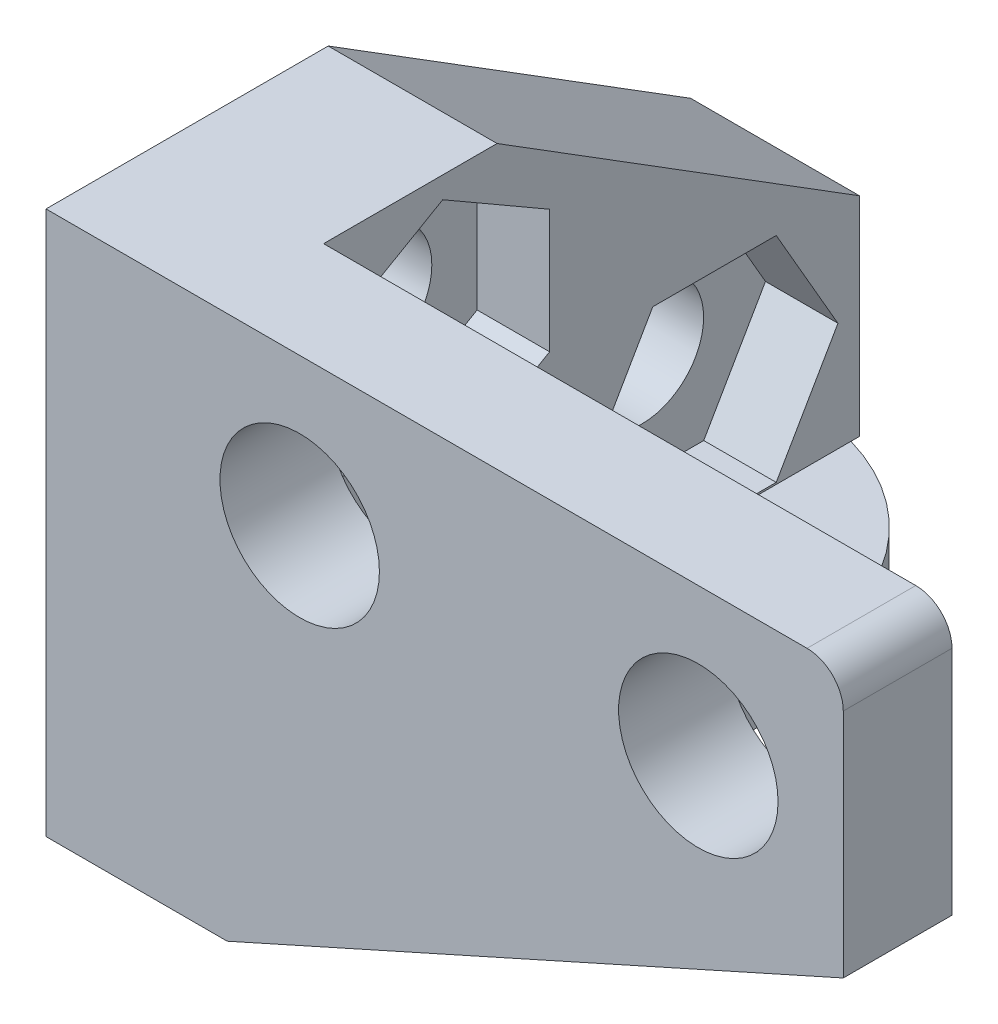
ISO-10303-21;
HEADER;
FILE_DESCRIPTION(('STEP AP214'),'2;1');
FILE_NAME('part.step','',(''),(''),'','','');
FILE_SCHEMA(('AUTOMOTIVE_DESIGN { 1 0 10303 214 1 1 1 1 }'));
ENDSEC;
DATA;
#1=APPLICATION_CONTEXT('core data for automotive mechanical design processes');
#2=APPLICATION_PROTOCOL_DEFINITION('international standard','automotive_design',2000,#1);
#3=PRODUCT_CONTEXT('',#1,'mechanical');
#4=PRODUCT('Part','Part','',(#3));
#5=PRODUCT_RELATED_PRODUCT_CATEGORY('part','',(#4));
#6=PRODUCT_DEFINITION_FORMATION('','',#4);
#7=PRODUCT_DEFINITION_CONTEXT('part definition',#1,'design');
#8=PRODUCT_DEFINITION('design','',#6,#7);
#9=PRODUCT_DEFINITION_SHAPE('','',#8);
#10=(LENGTH_UNIT() NAMED_UNIT(*) SI_UNIT(.MILLI.,.METRE.));
#11=(NAMED_UNIT(*) PLANE_ANGLE_UNIT() SI_UNIT($,.RADIAN.));
#12=(NAMED_UNIT(*) SI_UNIT($,.STERADIAN.) SOLID_ANGLE_UNIT());
#13=UNCERTAINTY_MEASURE_WITH_UNIT(LENGTH_MEASURE(1.E-05),#10,'distance_accuracy_value','');
#14=(GEOMETRIC_REPRESENTATION_CONTEXT(3) GLOBAL_UNCERTAINTY_ASSIGNED_CONTEXT((#13)) GLOBAL_UNIT_ASSIGNED_CONTEXT((#10,
#11,#12)) REPRESENTATION_CONTEXT('',''));
#15=CARTESIAN_POINT('',(0.,0.,0.));
#16=DIRECTION('',(0.,0.,1.));
#17=DIRECTION('',(1.,0.,0.));
#18=AXIS2_PLACEMENT_3D('',#15,#16,#17);
#19=CARTESIAN_POINT('',(1.99999999999999,4.00000000000002,-8.7866151357743));
#20=DIRECTION('',(-1.,0.,0.));
#21=DIRECTION('',(0.,-1.,0.));
#22=AXIS2_PLACEMENT_3D('',#19,#20,#21);
#23=CYLINDRICAL_SURFACE('',#22,1.7);
#24=CARTESIAN_POINT('',(-20.,4.00000000000001,-8.7866151357743));
#25=DIRECTION('',(-1.,0.,0.));
#26=DIRECTION('',(0.,-1.,0.));
#27=AXIS2_PLACEMENT_3D('',#24,#25,#26);
#28=CIRCLE('',#27,1.7);
#29=CARTESIAN_POINT('',(-20.,2.30000000000001,-8.7866151357743));
#30=VERTEX_POINT('',#29);
#31=EDGE_CURVE('E348',#30,#30,#28,.T.);
#32=ORIENTED_EDGE('',*,*,#31,.T.);
#33=EDGE_LOOP('',(#32));
#34=FACE_BOUND('',#33,.T.);
#35=CARTESIAN_POINT('',(-17.34,4.00000000000001,-8.7866151357743));
#36=DIRECTION('',(1.,0.,0.));
#37=DIRECTION('',(0.,0.,-1.));
#38=AXIS2_PLACEMENT_3D('',#35,#36,#37);
#39=CIRCLE('',#38,1.7);
#40=CARTESIAN_POINT('',(-17.34,4.00000000000001,-10.4866151357743));
#41=VERTEX_POINT('',#40);
#42=EDGE_CURVE('E45',#41,#41,#39,.F.);
#43=ORIENTED_EDGE('',*,*,#42,.F.);
#44=EDGE_LOOP('',(#43));
#45=FACE_BOUND('',#44,.T.);
#46=ADVANCED_FACE('F41',(#34,#45),#23,.F.);
#47=CARTESIAN_POINT('',(1.99999999999999,9.00000000000002,-1.2866151357743));
#48=DIRECTION('',(-1.,0.,0.));
#49=DIRECTION('',(0.,-1.,0.));
#50=AXIS2_PLACEMENT_3D('',#47,#48,#49);
#51=CYLINDRICAL_SURFACE('',#50,1.7);
#52=CARTESIAN_POINT('',(-20.,9.00000000000001,-1.2866151357743));
#53=DIRECTION('',(-1.,0.,0.));
#54=DIRECTION('',(0.,-1.,0.));
#55=AXIS2_PLACEMENT_3D('',#52,#53,#54);
#56=CIRCLE('',#55,1.7);
#57=CARTESIAN_POINT('',(-20.,7.30000000000001,-1.2866151357743));
#58=VERTEX_POINT('',#57);
#59=EDGE_CURVE('E345',#58,#58,#56,.T.);
#60=ORIENTED_EDGE('',*,*,#59,.T.);
#61=EDGE_LOOP('',(#60));
#62=FACE_BOUND('',#61,.T.);
#63=CARTESIAN_POINT('',(-17.34,9.00000000000001,-1.2866151357743));
#64=DIRECTION('',(1.,0.,0.));
#65=DIRECTION('',(0.,0.,-1.));
#66=AXIS2_PLACEMENT_3D('',#63,#64,#65);
#67=CIRCLE('',#66,1.7);
#68=CARTESIAN_POINT('',(-17.34,9.00000000000001,-2.9866151357743));
#69=VERTEX_POINT('',#68);
#70=EDGE_CURVE('E304',#69,#69,#67,.F.);
#71=ORIENTED_EDGE('',*,*,#70,.F.);
#72=EDGE_LOOP('',(#71));
#73=FACE_BOUND('',#72,.T.);
#74=ADVANCED_FACE('F503',(#62,#73),#51,.F.);
#75=CARTESIAN_POINT('',(0.,0.,2.));
#76=DIRECTION('',(0.,0.,-1.));
#77=DIRECTION('',(-1.,0.,0.));
#78=AXIS2_PLACEMENT_3D('',#75,#76,#77);
#79=PLANE('',#78);
#80=CARTESIAN_POINT('',(-2.00000000000001,8.93226907062247,2.));
#81=DIRECTION('',(0.,0.,-1.));
#82=DIRECTION('',(-1.,0.,0.));
#83=AXIS2_PLACEMENT_3D('',#80,#81,#82);
#84=CIRCLE('',#83,2.2);
#85=CARTESIAN_POINT('',(-4.20000000000001,8.93226907062247,2.));
#86=VERTEX_POINT('',#85);
#87=EDGE_CURVE('E336',#86,#86,#84,.T.);
#88=ORIENTED_EDGE('',*,*,#87,.F.);
#89=EDGE_LOOP('',(#88));
#90=FACE_BOUND('',#89,.T.);
#91=CARTESIAN_POINT('',(-13.,8.93226907062247,2.));
#92=DIRECTION('',(0.,0.,-1.));
#93=DIRECTION('',(-1.,0.,0.));
#94=AXIS2_PLACEMENT_3D('',#91,#92,#93);
#95=CIRCLE('',#94,2.2);
#96=CARTESIAN_POINT('',(-15.2,8.93226907062247,2.));
#97=VERTEX_POINT('',#96);
#98=EDGE_CURVE('E342',#97,#97,#95,.T.);
#99=ORIENTED_EDGE('',*,*,#98,.F.);
#100=EDGE_LOOP('',(#99));
#101=FACE_BOUND('',#100,.T.);
#102=DIRECTION('',(-1.,0.,0.));
#103=VECTOR('',#102,1.);
#104=CARTESIAN_POINT('',(0.,1.00000000000001,2.));
#105=LINE('',#104,#103);
#106=CARTESIAN_POINT('',(-9.,1.00000000000001,2.));
#107=VERTEX_POINT('',#106);
#108=CARTESIAN_POINT('',(-15.34,1.00000000000001,2.));
#109=VERTEX_POINT('',#108);
#110=EDGE_CURVE('E384',#107,#109,#105,.T.);
#111=ORIENTED_EDGE('',*,*,#110,.T.);
#112=DIRECTION('',(0.,-1.,0.));
#113=VECTOR('',#112,1.);
#114=CARTESIAN_POINT('',(-15.34,1.00000000000001,2.));
#115=LINE('',#114,#113);
#116=CARTESIAN_POINT('',(-15.34,13.,2.));
#117=VERTEX_POINT('',#116);
#118=EDGE_CURVE('E327',#117,#109,#115,.T.);
#119=ORIENTED_EDGE('',*,*,#118,.F.);
#120=DIRECTION('',(1.,0.,0.));
#121=VECTOR('',#120,1.);
#122=CARTESIAN_POINT('',(2.97851411655218,13.,2.));
#123=LINE('',#122,#121);
#124=CARTESIAN_POINT('',(0.999999999999988,13.,2.));
#125=VERTEX_POINT('',#124);
#126=EDGE_CURVE('E407',#117,#125,#123,.T.);
#127=ORIENTED_EDGE('',*,*,#126,.T.);
#128=CARTESIAN_POINT('',(0.999999999999988,12.,2.));
#129=DIRECTION('',(0.,0.,-1.));
#130=DIRECTION('',(-1.,0.,0.));
#131=AXIS2_PLACEMENT_3D('',#128,#129,#130);
#132=CIRCLE('',#131,1.);
#133=CARTESIAN_POINT('',(1.99999999999999,12.,2.));
#134=VERTEX_POINT('',#133);
#135=EDGE_CURVE('E398',#134,#125,#132,.F.);
#136=ORIENTED_EDGE('',*,*,#135,.F.);
#137=DIRECTION('',(0.,1.,0.));
#138=VECTOR('',#137,1.);
#139=CARTESIAN_POINT('',(1.99999999999999,0.,2.));
#140=LINE('',#139,#138);
#141=CARTESIAN_POINT('',(1.99999999999999,5.62068965517242,2.));
#142=VERTEX_POINT('',#141);
#143=EDGE_CURVE('E404',#142,#134,#140,.T.);
#144=ORIENTED_EDGE('',*,*,#143,.F.);
#145=DIRECTION('',(-0.912509324514951,-0.409055904092909,0.));
#146=VECTOR('',#145,1.);
#147=CARTESIAN_POINT('',(-1.76336633663367,3.93366336633664,2.));
#148=LINE('',#147,#146);
#149=CARTESIAN_POINT('',(-8.99999999999998,0.689655172413814,2.));
#150=VERTEX_POINT('',#149);
#151=EDGE_CURVE('E410',#142,#150,#148,.T.);
#152=ORIENTED_EDGE('',*,*,#151,.T.);
#153=DIRECTION('',(0.,-1.,0.));
#154=VECTOR('',#153,1.);
#155=CARTESIAN_POINT('',(-8.99999999999998,1.00000000000001,2.));
#156=LINE('',#155,#154);
#157=EDGE_CURVE('E381',#107,#150,#156,.T.);
#158=ORIENTED_EDGE('',*,*,#157,.F.);
#159=EDGE_LOOP('',(#111,#119,#127,#136,#144,#152,#158));
#160=FACE_BOUND('',#159,.T.);
#161=ADVANCED_FACE('F465',(#90,#101,#160),#79,.T.);
#162=CARTESIAN_POINT('',(0.,1.00000000000001,0.));
#163=DIRECTION('',(0.,-1.,0.));
#164=DIRECTION('',(1.,0.,0.));
#165=AXIS2_PLACEMENT_3D('',#162,#163,#164);
#166=PLANE('',#165);
#167=DIRECTION('',(0.,0.,-1.));
#168=VECTOR('',#167,1.);
#169=CARTESIAN_POINT('',(-15.34,1.00000000000001,-12.7866151357743));
#170=LINE('',#169,#168);
#171=CARTESIAN_POINT('',(-15.34,1.00000000000001,-12.5524108310795));
#172=VERTEX_POINT('',#171);
#173=EDGE_CURVE('E314',#109,#172,#170,.T.);
#174=ORIENTED_EDGE('',*,*,#173,.F.);
#175=ORIENTED_EDGE('',*,*,#110,.F.);
#176=CARTESIAN_POINT('',(-9.,1.00000000000001,0.));
#177=DIRECTION('',(0.,-1.,0.));
#178=DIRECTION('',(1.,0.,0.));
#179=AXIS2_PLACEMENT_3D('',#176,#177,#178);
#180=CIRCLE('',#179,2.);
#181=CARTESIAN_POINT('',(-11.,1.00000000000001,0.));
#182=VERTEX_POINT('',#181);
#183=EDGE_CURVE('E375',#182,#107,#180,.F.);
#184=ORIENTED_EDGE('',*,*,#183,.F.);
#185=DIRECTION('',(0.,0.,1.));
#186=VECTOR('',#185,1.);
#187=CARTESIAN_POINT('',(-11.,1.00000000000001,0.));
#188=LINE('',#187,#186);
#189=CARTESIAN_POINT('',(-11.,1.00000000000001,-6.78661513577429));
#190=VERTEX_POINT('',#189);
#191=EDGE_CURVE('E371',#190,#182,#188,.T.);
#192=ORIENTED_EDGE('',*,*,#191,.F.);
#193=CARTESIAN_POINT('',(-17.,1.00000000000001,-6.78661513577426));
#194=DIRECTION('',(0.,-1.,0.));
#195=DIRECTION('',(1.,0.,0.));
#196=AXIS2_PLACEMENT_3D('',#193,#194,#195);
#197=CIRCLE('',#196,6.00000000000003);
#198=EDGE_CURVE('E372',#172,#190,#197,.T.);
#199=ORIENTED_EDGE('',*,*,#198,.F.);
#200=EDGE_LOOP('',(#174,#175,#184,#192,#199));
#201=FACE_BOUND('',#200,.T.);
#202=ADVANCED_FACE('F439',(#201),#166,.F.);
#203=CARTESIAN_POINT('',(-1.76336633663367,3.93366336633664,0.));
#204=DIRECTION('',(-0.409055904092909,0.912509324514951,0.));
#205=DIRECTION('',(-0.912509324514951,-0.409055904092909,0.));
#206=AXIS2_PLACEMENT_3D('',#203,#204,#205);
#207=PLANE('',#206);
#208=DIRECTION('',(-0.912509324514951,-0.409055904092909,0.));
#209=VECTOR('',#208,1.);
#210=CARTESIAN_POINT('',(-1.76336633663367,3.93366336633664,5.));
#211=LINE('',#210,#209);
#212=CARTESIAN_POINT('',(1.99999999999999,5.62068965517242,5.));
#213=VERTEX_POINT('',#212);
#214=CARTESIAN_POINT('',(-15.,-1.99999999999999,5.));
#215=VERTEX_POINT('',#214);
#216=EDGE_CURVE('E477',#213,#215,#211,.T.);
#217=ORIENTED_EDGE('',*,*,#216,.T.);
#218=DIRECTION('',(0.,0.,1.));
#219=VECTOR('',#218,1.);
#220=CARTESIAN_POINT('',(-15.,-1.99999999999999,0.));
#221=LINE('',#220,#219);
#222=CARTESIAN_POINT('',(-15.,-1.99999999999999,-12.4434693852667));
#223=VERTEX_POINT('',#222);
#224=EDGE_CURVE('E450',#223,#215,#221,.T.);
#225=ORIENTED_EDGE('',*,*,#224,.F.);
#226=CARTESIAN_POINT('',(-17.,-2.89655172413793,-6.78661513577426));
#227=DIRECTION('',(-0.409055904092909,0.912509324514951,0.));
#228=DIRECTION('',(-0.912509324514951,-0.409055904092909,0.));
#229=AXIS2_PLACEMENT_3D('',#226,#227,#228);
#230=ELLIPSE('',#229,6.57527527533964,6.00000000000003);
#231=CARTESIAN_POINT('',(-11.,-0.206896551724127,-6.78661513577429));
#232=VERTEX_POINT('',#231);
#233=EDGE_CURVE('E12',#223,#232,#230,.F.);
#234=ORIENTED_EDGE('',*,*,#233,.T.);
#235=DIRECTION('',(0.,0.,1.));
#236=VECTOR('',#235,1.);
#237=CARTESIAN_POINT('',(-11.,-0.206896551724127,0.));
#238=LINE('',#237,#236);
#239=CARTESIAN_POINT('',(-11.,-0.206896551724127,0.));
#240=VERTEX_POINT('',#239);
#241=EDGE_CURVE('E363',#232,#240,#238,.T.);
#242=ORIENTED_EDGE('',*,*,#241,.T.);
#243=CARTESIAN_POINT('',(-9.,0.689655172413805,0.));
#244=DIRECTION('',(-0.409055904092909,0.912509324514951,0.));
#245=DIRECTION('',(-0.912509324514951,-0.409055904092909,0.));
#246=AXIS2_PLACEMENT_3D('',#243,#244,#245);
#247=ELLIPSE('',#246,2.1917584251132,2.);
#248=EDGE_CURVE('E365',#240,#150,#247,.T.);
#249=ORIENTED_EDGE('',*,*,#248,.T.);
#250=ORIENTED_EDGE('',*,*,#151,.F.);
#251=DIRECTION('',(0.,0.,-1.));
#252=VECTOR('',#251,1.);
#253=CARTESIAN_POINT('',(1.99999999999999,5.62068965517242,0.));
#254=LINE('',#253,#252);
#255=EDGE_CURVE('E485',#213,#142,#254,.T.);
#256=ORIENTED_EDGE('',*,*,#255,.F.);
#257=EDGE_LOOP('',(#217,#225,#234,#242,#249,#250,#256));
#258=FACE_BOUND('',#257,.T.);
#259=ADVANCED_FACE('F489',(#258),#207,.F.);
#260=CARTESIAN_POINT('',(2.97851411655218,13.,0.));
#261=DIRECTION('',(0.,-1.,0.));
#262=DIRECTION('',(1.,0.,0.));
#263=AXIS2_PLACEMENT_3D('',#260,#261,#262);
#264=PLANE('',#263);
#265=DIRECTION('',(1.,0.,0.));
#266=VECTOR('',#265,1.);
#267=CARTESIAN_POINT('',(-20.,13.,-2.78661513577426));
#268=LINE('',#267,#266);
#269=CARTESIAN_POINT('',(-20.,13.,-2.78661513577426));
#270=VERTEX_POINT('',#269);
#271=CARTESIAN_POINT('',(-15.34,13.,-2.78661513577426));
#272=VERTEX_POINT('',#271);
#273=EDGE_CURVE('E396',#270,#272,#268,.T.);
#274=ORIENTED_EDGE('',*,*,#273,.F.);
#275=DIRECTION('',(0.,0.,-1.));
#276=VECTOR('',#275,1.);
#277=CARTESIAN_POINT('',(-20.,13.,-2.78661513577426));
#278=LINE('',#277,#276);
#279=CARTESIAN_POINT('',(-20.,13.,5.));
#280=VERTEX_POINT('',#279);
#281=EDGE_CURVE('E353',#280,#270,#278,.T.);
#282=ORIENTED_EDGE('',*,*,#281,.F.);
#283=DIRECTION('',(1.,0.,0.));
#284=VECTOR('',#283,1.);
#285=CARTESIAN_POINT('',(0.,13.,5.));
#286=LINE('',#285,#284);
#287=CARTESIAN_POINT('',(0.999999999999988,13.,5.));
#288=VERTEX_POINT('',#287);
#289=EDGE_CURVE('E482',#280,#288,#286,.T.);
#290=ORIENTED_EDGE('',*,*,#289,.T.);
#291=DIRECTION('',(0.,0.,1.));
#292=VECTOR('',#291,1.);
#293=CARTESIAN_POINT('',(0.999999999999988,13.,0.));
#294=LINE('',#293,#292);
#295=EDGE_CURVE('E50',#288,#125,#294,.F.);
#296=ORIENTED_EDGE('',*,*,#295,.T.);
#297=ORIENTED_EDGE('',*,*,#126,.F.);
#298=DIRECTION('',(0.,0.,1.));
#299=VECTOR('',#298,1.);
#300=CARTESIAN_POINT('',(-15.34,13.,2.));
#301=LINE('',#300,#299);
#302=EDGE_CURVE('E324',#272,#117,#301,.T.);
#303=ORIENTED_EDGE('',*,*,#302,.F.);
#304=EDGE_LOOP('',(#274,#282,#290,#296,#297,#303));
#305=FACE_BOUND('',#304,.T.);
#306=ADVANCED_FACE('F460',(#305),#264,.F.);
#307=CARTESIAN_POINT('',(0.,-1.99999999999999,0.));
#308=DIRECTION('',(0.,1.,0.));
#309=DIRECTION('',(-1.,0.,0.));
#310=AXIS2_PLACEMENT_3D('',#307,#308,#309);
#311=PLANE('',#310);
#312=DIRECTION('',(1.,0.,0.));
#313=VECTOR('',#312,1.);
#314=CARTESIAN_POINT('',(-20.,-1.99999999999999,5.));
#315=LINE('',#314,#313);
#316=CARTESIAN_POINT('',(-20.,-1.99999999999999,5.));
#317=VERTEX_POINT('',#316);
#318=EDGE_CURVE('E361',#317,#215,#315,.T.);
#319=ORIENTED_EDGE('',*,*,#318,.F.);
#320=DIRECTION('',(0.,0.,1.));
#321=VECTOR('',#320,1.);
#322=CARTESIAN_POINT('',(-20.,-1.99999999999999,5.));
#323=LINE('',#322,#321);
#324=CARTESIAN_POINT('',(-20.,-1.99999999999998,-12.7866151357743));
#325=VERTEX_POINT('',#324);
#326=EDGE_CURVE('E359',#325,#317,#323,.T.);
#327=ORIENTED_EDGE('',*,*,#326,.F.);
#328=DIRECTION('',(1.,0.,0.));
#329=VECTOR('',#328,1.);
#330=CARTESIAN_POINT('',(-20.,-1.99999999999998,-12.7866151357743));
#331=LINE('',#330,#329);
#332=CARTESIAN_POINT('',(-17.,-1.99999999999999,-12.7866151357743));
#333=VERTEX_POINT('',#332);
#334=EDGE_CURVE('E395',#325,#333,#331,.T.);
#335=ORIENTED_EDGE('',*,*,#334,.T.);
#336=CARTESIAN_POINT('',(-17.,-1.99999999999999,-6.78661513577426));
#337=DIRECTION('',(0.,-1.,0.));
#338=DIRECTION('',(1.,0.,0.));
#339=AXIS2_PLACEMENT_3D('',#336,#337,#338);
#340=CIRCLE('',#339,6.00000000000003);
#341=EDGE_CURVE('E368',#333,#223,#340,.T.);
#342=ORIENTED_EDGE('',*,*,#341,.T.);
#343=ORIENTED_EDGE('',*,*,#224,.T.);
#344=EDGE_LOOP('',(#319,#327,#335,#342,#343));
#345=FACE_BOUND('',#344,.T.);
#346=ADVANCED_FACE('F449',(#345),#311,.F.);
#347=CARTESIAN_POINT('',(1.99999999999999,0.,10.));
#348=DIRECTION('',(1.,0.,0.));
#349=DIRECTION('',(0.,0.,-1.));
#350=AXIS2_PLACEMENT_3D('',#347,#348,#349);
#351=PLANE('',#350);
#352=ORIENTED_EDGE('',*,*,#255,.T.);
#353=ORIENTED_EDGE('',*,*,#143,.T.);
#354=DIRECTION('',(0.,0.,1.));
#355=VECTOR('',#354,1.);
#356=CARTESIAN_POINT('',(1.99999999999999,12.,5.));
#357=LINE('',#356,#355);
#358=CARTESIAN_POINT('',(1.99999999999999,12.,5.));
#359=VERTEX_POINT('',#358);
#360=EDGE_CURVE('E470',#134,#359,#357,.T.);
#361=ORIENTED_EDGE('',*,*,#360,.T.);
#362=DIRECTION('',(0.,1.,0.));
#363=VECTOR('',#362,1.);
#364=CARTESIAN_POINT('',(1.99999999999999,0.,5.));
#365=LINE('',#364,#363);
#366=EDGE_CURVE('E484',#213,#359,#365,.T.);
#367=ORIENTED_EDGE('',*,*,#366,.F.);
#368=EDGE_LOOP('',(#352,#353,#361,#367));
#369=FACE_BOUND('',#368,.T.);
#370=ADVANCED_FACE('F535',(#369),#351,.T.);
#371=CARTESIAN_POINT('',(0.999999999999988,12.,10.));
#372=DIRECTION('',(0.,0.,-1.));
#373=DIRECTION('',(-1.,0.,0.));
#374=AXIS2_PLACEMENT_3D('',#371,#372,#373);
#375=CYLINDRICAL_SURFACE('',#374,1.);
#376=ORIENTED_EDGE('',*,*,#360,.F.);
#377=ORIENTED_EDGE('',*,*,#135,.T.);
#378=ORIENTED_EDGE('',*,*,#295,.F.);
#379=CARTESIAN_POINT('',(0.999999999999988,12.,5.));
#380=DIRECTION('',(0.,0.,1.));
#381=DIRECTION('',(1.,0.,0.));
#382=AXIS2_PLACEMENT_3D('',#379,#380,#381);
#383=CIRCLE('',#382,1.);
#384=EDGE_CURVE('E472',#359,#288,#383,.T.);
#385=ORIENTED_EDGE('',*,*,#384,.F.);
#386=EDGE_LOOP('',(#376,#377,#378,#385));
#387=FACE_BOUND('',#386,.T.);
#388=ADVANCED_FACE('F43',(#387),#375,.T.);
#389=CARTESIAN_POINT('',(0.,0.,5.));
#390=DIRECTION('',(0.,0.,1.));
#391=DIRECTION('',(1.,0.,0.));
#392=AXIS2_PLACEMENT_3D('',#389,#390,#391);
#393=PLANE('',#392);
#394=CARTESIAN_POINT('',(-2.00000000000001,8.93226907062247,5.));
#395=DIRECTION('',(0.,0.,1.));
#396=DIRECTION('',(1.,0.,0.));
#397=AXIS2_PLACEMENT_3D('',#394,#395,#396);
#398=CIRCLE('',#397,2.2);
#399=CARTESIAN_POINT('',(0.199999999999988,8.93226907062247,5.));
#400=VERTEX_POINT('',#399);
#401=EDGE_CURVE('E333',#400,#400,#398,.T.);
#402=ORIENTED_EDGE('',*,*,#401,.F.);
#403=EDGE_LOOP('',(#402));
#404=FACE_BOUND('',#403,.T.);
#405=CARTESIAN_POINT('',(-13.,8.93226907062247,5.));
#406=DIRECTION('',(0.,0.,1.));
#407=DIRECTION('',(1.,0.,0.));
#408=AXIS2_PLACEMENT_3D('',#405,#406,#407);
#409=CIRCLE('',#408,2.2);
#410=CARTESIAN_POINT('',(-10.8,8.93226907062247,5.));
#411=VERTEX_POINT('',#410);
#412=EDGE_CURVE('E339',#411,#411,#409,.T.);
#413=ORIENTED_EDGE('',*,*,#412,.F.);
#414=EDGE_LOOP('',(#413));
#415=FACE_BOUND('',#414,.T.);
#416=DIRECTION('',(0.,1.,0.));
#417=VECTOR('',#416,1.);
#418=CARTESIAN_POINT('',(-20.,13.,5.));
#419=LINE('',#418,#417);
#420=EDGE_CURVE('E351',#317,#280,#419,.T.);
#421=ORIENTED_EDGE('',*,*,#420,.F.);
#422=ORIENTED_EDGE('',*,*,#318,.T.);
#423=ORIENTED_EDGE('',*,*,#216,.F.);
#424=ORIENTED_EDGE('',*,*,#366,.T.);
#425=ORIENTED_EDGE('',*,*,#384,.T.);
#426=ORIENTED_EDGE('',*,*,#289,.F.);
#427=EDGE_LOOP('',(#421,#422,#423,#424,#425,#426));
#428=FACE_BOUND('',#427,.T.);
#429=ADVANCED_FACE('F541',(#404,#415,#428),#393,.T.);
#430=CARTESIAN_POINT('',(-20.,10.6017090008096,-6.62468303246712));
#431=DIRECTION('',(0.,-0.848048096156427,0.529919264233203));
#432=DIRECTION('',(0.,-0.529919264233203,-0.848048096156427));
#433=AXIS2_PLACEMENT_3D('',#430,#431,#432);
#434=PLANE('',#433);
#435=DIRECTION('',(1.,0.,0.));
#436=VECTOR('',#435,1.);
#437=CARTESIAN_POINT('',(-20.,6.75130648090675,-12.7866151357743));
#438=LINE('',#437,#436);
#439=CARTESIAN_POINT('',(-20.,6.75130648090675,-12.7866151357743));
#440=VERTEX_POINT('',#439);
#441=CARTESIAN_POINT('',(-15.34,6.75130648090675,-12.7866151357743));
#442=VERTEX_POINT('',#441);
#443=EDGE_CURVE('E399',#440,#442,#438,.T.);
#444=ORIENTED_EDGE('',*,*,#443,.F.);
#445=DIRECTION('',(0.,-0.529919264233203,-0.848048096156427));
#446=VECTOR('',#445,1.);
#447=CARTESIAN_POINT('',(-20.,6.75130648090675,-12.7866151357743));
#448=LINE('',#447,#446);
#449=EDGE_CURVE('E355',#270,#440,#448,.T.);
#450=ORIENTED_EDGE('',*,*,#449,.F.);
#451=ORIENTED_EDGE('',*,*,#273,.T.);
#452=DIRECTION('',(0.,0.529919264233203,0.848048096156427));
#453=VECTOR('',#452,1.);
#454=CARTESIAN_POINT('',(-15.34,13.,-2.78661513577426));
#455=LINE('',#454,#453);
#456=EDGE_CURVE('E321',#442,#272,#455,.T.);
#457=ORIENTED_EDGE('',*,*,#456,.F.);
#458=EDGE_LOOP('',(#444,#450,#451,#457));
#459=FACE_BOUND('',#458,.T.);
#460=ADVANCED_FACE('F455',(#459),#434,.F.);
#461=CARTESIAN_POINT('',(-20.,0.,-12.7866151357743));
#462=DIRECTION('',(0.,0.,1.));
#463=DIRECTION('',(1.,0.,0.));
#464=AXIS2_PLACEMENT_3D('',#461,#462,#463);
#465=PLANE('',#464);
#466=ORIENTED_EDGE('',*,*,#334,.F.);
#467=DIRECTION('',(0.,-1.,0.));
#468=VECTOR('',#467,1.);
#469=CARTESIAN_POINT('',(-20.,-1.99999999999998,-12.7866151357743));
#470=LINE('',#469,#468);
#471=EDGE_CURVE('E357',#440,#325,#470,.T.);
#472=ORIENTED_EDGE('',*,*,#471,.F.);
#473=ORIENTED_EDGE('',*,*,#443,.T.);
#474=DIRECTION('',(0.,1.,0.));
#475=VECTOR('',#474,1.);
#476=CARTESIAN_POINT('',(-15.34,6.75130648090675,-12.7866151357743));
#477=LINE('',#476,#475);
#478=CARTESIAN_POINT('',(-15.34,1.00000000000001,-12.7866151357743));
#479=VERTEX_POINT('',#478);
#480=EDGE_CURVE('E317',#479,#442,#477,.T.);
#481=ORIENTED_EDGE('',*,*,#480,.F.);
#482=DIRECTION('',(-1.,0.,0.));
#483=VECTOR('',#482,1.);
#484=CARTESIAN_POINT('',(-15.34,1.00000000000001,-12.7866151357743));
#485=LINE('',#484,#483);
#486=CARTESIAN_POINT('',(-17.,1.00000000000001,-12.7866151357743));
#487=VERTEX_POINT('',#486);
#488=EDGE_CURVE('E330',#479,#487,#485,.T.);
#489=ORIENTED_EDGE('',*,*,#488,.T.);
#490=DIRECTION('',(0.,-1.,0.));
#491=VECTOR('',#490,1.);
#492=CARTESIAN_POINT('',(-17.,1.00000000000001,-12.7866151357743));
#493=LINE('',#492,#491);
#494=EDGE_CURVE('E378',#487,#333,#493,.T.);
#495=ORIENTED_EDGE('',*,*,#494,.T.);
#496=EDGE_LOOP('',(#466,#472,#473,#481,#489,#495));
#497=FACE_BOUND('',#496,.T.);
#498=ADVANCED_FACE('F427',(#497),#465,.F.);
#499=CARTESIAN_POINT('',(-9.,1.00000000000001,0.));
#500=DIRECTION('',(0.,-1.,0.));
#501=DIRECTION('',(1.,0.,0.));
#502=AXIS2_PLACEMENT_3D('',#499,#500,#501);
#503=CYLINDRICAL_SURFACE('',#502,2.);
#504=ORIENTED_EDGE('',*,*,#248,.F.);
#505=DIRECTION('',(0.,-1.,0.));
#506=VECTOR('',#505,1.);
#507=CARTESIAN_POINT('',(-11.,1.00000000000001,0.));
#508=LINE('',#507,#506);
#509=EDGE_CURVE('E385',#182,#240,#508,.T.);
#510=ORIENTED_EDGE('',*,*,#509,.F.);
#511=ORIENTED_EDGE('',*,*,#183,.T.);
#512=ORIENTED_EDGE('',*,*,#157,.T.);
#513=EDGE_LOOP('',(#504,#510,#511,#512));
#514=FACE_BOUND('',#513,.T.);
#515=ADVANCED_FACE('F491',(#514),#503,.F.);
#516=CARTESIAN_POINT('',(-11.,1.00000000000001,0.));
#517=DIRECTION('',(1.,0.,0.));
#518=DIRECTION('',(0.,1.,0.));
#519=AXIS2_PLACEMENT_3D('',#516,#517,#518);
#520=PLANE('',#519);
#521=ORIENTED_EDGE('',*,*,#241,.F.);
#522=DIRECTION('',(0.,-1.,0.));
#523=VECTOR('',#522,1.);
#524=CARTESIAN_POINT('',(-11.,1.00000000000001,-6.78661513577429));
#525=LINE('',#524,#523);
#526=EDGE_CURVE('E388',#190,#232,#525,.T.);
#527=ORIENTED_EDGE('',*,*,#526,.F.);
#528=ORIENTED_EDGE('',*,*,#191,.T.);
#529=ORIENTED_EDGE('',*,*,#509,.T.);
#530=EDGE_LOOP('',(#521,#527,#528,#529));
#531=FACE_BOUND('',#530,.T.);
#532=ADVANCED_FACE('F444',(#531),#520,.T.);
#533=CARTESIAN_POINT('',(-17.,1.00000000000001,-6.78661513577426));
#534=DIRECTION('',(0.,-1.,0.));
#535=DIRECTION('',(1.,0.,0.));
#536=AXIS2_PLACEMENT_3D('',#533,#534,#535);
#537=CYLINDRICAL_SURFACE('',#536,6.00000000000003);
#538=ORIENTED_EDGE('',*,*,#233,.F.);
#539=ORIENTED_EDGE('',*,*,#341,.F.);
#540=ORIENTED_EDGE('',*,*,#494,.F.);
#541=EDGE_CURVE('E369',#487,#172,#197,.T.);
#542=ORIENTED_EDGE('',*,*,#541,.T.);
#543=ORIENTED_EDGE('',*,*,#198,.T.);
#544=ORIENTED_EDGE('',*,*,#526,.T.);
#545=EDGE_LOOP('',(#538,#539,#540,#542,#543,#544));
#546=FACE_BOUND('',#545,.T.);
#547=ADVANCED_FACE('F434',(#546),#537,.T.);
#548=CARTESIAN_POINT('',(-20.,0.,0.));
#549=DIRECTION('',(1.,0.,0.));
#550=DIRECTION('',(0.,1.,0.));
#551=AXIS2_PLACEMENT_3D('',#548,#549,#550);
#552=PLANE('',#551);
#553=ORIENTED_EDGE('',*,*,#59,.F.);
#554=EDGE_LOOP('',(#553));
#555=FACE_BOUND('',#554,.T.);
#556=ORIENTED_EDGE('',*,*,#31,.F.);
#557=EDGE_LOOP('',(#556));
#558=FACE_BOUND('',#557,.T.);
#559=ORIENTED_EDGE('',*,*,#420,.T.);
#560=ORIENTED_EDGE('',*,*,#281,.T.);
#561=ORIENTED_EDGE('',*,*,#449,.T.);
#562=ORIENTED_EDGE('',*,*,#471,.T.);
#563=ORIENTED_EDGE('',*,*,#326,.T.);
#564=EDGE_LOOP('',(#559,#560,#561,#562,#563));
#565=FACE_BOUND('',#564,.T.);
#566=ADVANCED_FACE('F515',(#555,#558,#565),#552,.F.);
#567=CARTESIAN_POINT('',(-13.,8.93226907062247,-5.));
#568=DIRECTION('',(0.,0.,1.));
#569=DIRECTION('',(1.,0.,0.));
#570=AXIS2_PLACEMENT_3D('',#567,#568,#569);
#571=CYLINDRICAL_SURFACE('',#570,2.2);
#572=ORIENTED_EDGE('',*,*,#98,.T.);
#573=EDGE_LOOP('',(#572));
#574=FACE_BOUND('',#573,.T.);
#575=ORIENTED_EDGE('',*,*,#412,.T.);
#576=EDGE_LOOP('',(#575));
#577=FACE_BOUND('',#576,.T.);
#578=ADVANCED_FACE('F517',(#574,#577),#571,.F.);
#579=CARTESIAN_POINT('',(-2.00000000000001,8.93226907062247,-5.));
#580=DIRECTION('',(0.,0.,1.));
#581=DIRECTION('',(1.,0.,0.));
#582=AXIS2_PLACEMENT_3D('',#579,#580,#581);
#583=CYLINDRICAL_SURFACE('',#582,2.2);
#584=ORIENTED_EDGE('',*,*,#87,.T.);
#585=EDGE_LOOP('',(#584));
#586=FACE_BOUND('',#585,.T.);
#587=ORIENTED_EDGE('',*,*,#401,.T.);
#588=EDGE_LOOP('',(#587));
#589=FACE_BOUND('',#588,.T.);
#590=ADVANCED_FACE('F557',(#586,#589),#583,.F.);
#591=CARTESIAN_POINT('',(-15.34,0.,0.));
#592=DIRECTION('',(-1.,0.,0.));
#593=DIRECTION('',(0.,0.,1.));
#594=AXIS2_PLACEMENT_3D('',#591,#592,#593);
#595=PLANE('',#594);
#596=DIRECTION('',(0.,-0.866025403784439,-0.5));
#597=VECTOR('',#596,1.);
#598=CARTESIAN_POINT('',(-15.34,4.00000000000001,-5.38024854755551));
#599=LINE('',#598,#597);
#600=CARTESIAN_POINT('',(-15.34,4.00000000000001,-5.38024854755551));
#601=VERTEX_POINT('',#600);
#602=CARTESIAN_POINT('',(-15.34,1.05000000000001,-7.08343184166491));
#603=VERTEX_POINT('',#602);
#604=EDGE_CURVE('E248',#601,#603,#599,.T.);
#605=ORIENTED_EDGE('',*,*,#604,.F.);
#606=DIRECTION('',(0.,-0.866025403784439,0.5));
#607=VECTOR('',#606,1.);
#608=CARTESIAN_POINT('',(-15.34,6.95000000000001,-7.08343184166491));
#609=LINE('',#608,#607);
#610=CARTESIAN_POINT('',(-15.34,6.95000000000001,-7.08343184166491));
#611=VERTEX_POINT('',#610);
#612=EDGE_CURVE('E58',#611,#601,#609,.T.);
#613=ORIENTED_EDGE('',*,*,#612,.F.);
#614=DIRECTION('',(0.,0.,1.));
#615=VECTOR('',#614,1.);
#616=CARTESIAN_POINT('',(-15.34,6.95000000000001,-10.4897984298837));
#617=LINE('',#616,#615);
#618=CARTESIAN_POINT('',(-15.34,6.95000000000001,-10.4897984298837));
#619=VERTEX_POINT('',#618);
#620=EDGE_CURVE('E234',#619,#611,#617,.T.);
#621=ORIENTED_EDGE('',*,*,#620,.F.);
#622=DIRECTION('',(0.,0.866025403784439,0.5));
#623=VECTOR('',#622,1.);
#624=CARTESIAN_POINT('',(-15.34,4.00000000000001,-12.1929817239931));
#625=LINE('',#624,#623);
#626=CARTESIAN_POINT('',(-15.34,4.00000000000001,-12.1929817239931));
#627=VERTEX_POINT('',#626);
#628=EDGE_CURVE('E237',#627,#619,#625,.T.);
#629=ORIENTED_EDGE('',*,*,#628,.F.);
#630=DIRECTION('',(0.,0.866025403784439,-0.5));
#631=VECTOR('',#630,1.);
#632=CARTESIAN_POINT('',(-15.34,1.05000000000001,-10.4897984298837));
#633=LINE('',#632,#631);
#634=CARTESIAN_POINT('',(-15.34,1.05000000000001,-10.4897984298837));
#635=VERTEX_POINT('',#634);
#636=EDGE_CURVE('E253',#635,#627,#633,.T.);
#637=ORIENTED_EDGE('',*,*,#636,.F.);
#638=DIRECTION('',(0.,0.,-1.));
#639=VECTOR('',#638,1.);
#640=CARTESIAN_POINT('',(-15.34,1.05000000000001,-7.08343184166491));
#641=LINE('',#640,#639);
#642=EDGE_CURVE('E250',#603,#635,#641,.T.);
#643=ORIENTED_EDGE('',*,*,#642,.F.);
#644=EDGE_LOOP('',(#605,#613,#621,#629,#637,#643));
#645=FACE_BOUND('',#644,.T.);
#646=DIRECTION('',(0.,-0.5,-0.866025403784438));
#647=VECTOR('',#646,1.);
#648=CARTESIAN_POINT('',(-15.34,7.29681670589062,1.6633848642257));
#649=LINE('',#648,#647);
#650=CARTESIAN_POINT('',(-15.34,7.29681670589062,1.6633848642257));
#651=VERTEX_POINT('',#650);
#652=CARTESIAN_POINT('',(-15.34,5.59363341178122,-1.2866151357743));
#653=VERTEX_POINT('',#652);
#654=EDGE_CURVE('E288',#651,#653,#649,.T.);
#655=ORIENTED_EDGE('',*,*,#654,.F.);
#656=DIRECTION('',(0.,-1.,0.));
#657=VECTOR('',#656,1.);
#658=CARTESIAN_POINT('',(-15.34,10.7031832941094,1.6633848642257));
#659=LINE('',#658,#657);
#660=CARTESIAN_POINT('',(-15.34,10.7031832941094,1.6633848642257));
#661=VERTEX_POINT('',#660);
#662=EDGE_CURVE('E66',#661,#651,#659,.T.);
#663=ORIENTED_EDGE('',*,*,#662,.F.);
#664=DIRECTION('',(0.,-0.5,0.866025403784439));
#665=VECTOR('',#664,1.);
#666=CARTESIAN_POINT('',(-15.34,12.4063665882188,-1.2866151357743));
#667=LINE('',#666,#665);
#668=CARTESIAN_POINT('',(-15.34,12.4063665882188,-1.2866151357743));
#669=VERTEX_POINT('',#668);
#670=EDGE_CURVE('E271',#669,#661,#667,.T.);
#671=ORIENTED_EDGE('',*,*,#670,.F.);
#672=DIRECTION('',(0.,0.5,0.866025403784438));
#673=VECTOR('',#672,1.);
#674=CARTESIAN_POINT('',(-15.34,10.7031832941094,-4.2366151357743));
#675=LINE('',#674,#673);
#676=CARTESIAN_POINT('',(-15.34,10.7031832941094,-4.2366151357743));
#677=VERTEX_POINT('',#676);
#678=EDGE_CURVE('E297',#677,#669,#675,.T.);
#679=ORIENTED_EDGE('',*,*,#678,.F.);
#680=DIRECTION('',(0.,1.,0.));
#681=VECTOR('',#680,1.);
#682=CARTESIAN_POINT('',(-15.34,7.29681670589062,-4.2366151357743));
#683=LINE('',#682,#681);
#684=CARTESIAN_POINT('',(-15.34,7.29681670589062,-4.2366151357743));
#685=VERTEX_POINT('',#684);
#686=EDGE_CURVE('E294',#685,#677,#683,.T.);
#687=ORIENTED_EDGE('',*,*,#686,.F.);
#688=DIRECTION('',(0.,0.5,-0.866025403784438));
#689=VECTOR('',#688,1.);
#690=CARTESIAN_POINT('',(-15.34,5.59363341178122,-1.2866151357743));
#691=LINE('',#690,#689);
#692=EDGE_CURVE('E291',#653,#685,#691,.T.);
#693=ORIENTED_EDGE('',*,*,#692,.F.);
#694=EDGE_LOOP('',(#655,#663,#671,#679,#687,#693));
#695=FACE_BOUND('',#694,.T.);
#696=ORIENTED_EDGE('',*,*,#173,.T.);
#697=EDGE_CURVE('E318',#172,#479,#170,.T.);
#698=ORIENTED_EDGE('',*,*,#697,.T.);
#699=ORIENTED_EDGE('',*,*,#480,.T.);
#700=ORIENTED_EDGE('',*,*,#456,.T.);
#701=ORIENTED_EDGE('',*,*,#302,.T.);
#702=ORIENTED_EDGE('',*,*,#118,.T.);
#703=EDGE_LOOP('',(#696,#698,#699,#700,#701,#702));
#704=FACE_BOUND('',#703,.T.);
#705=ADVANCED_FACE('F420',(#645,#695,#704),#595,.F.);
#706=CARTESIAN_POINT('',(-15.34,1.00000000000001,-12.7866151357743));
#707=DIRECTION('',(0.,1.,0.));
#708=DIRECTION('',(-1.,0.,0.));
#709=AXIS2_PLACEMENT_3D('',#706,#707,#708);
#710=PLANE('',#709);
#711=ORIENTED_EDGE('',*,*,#541,.F.);
#712=ORIENTED_EDGE('',*,*,#488,.F.);
#713=ORIENTED_EDGE('',*,*,#697,.F.);
#714=EDGE_LOOP('',(#711,#712,#713));
#715=FACE_BOUND('',#714,.T.);
#716=ADVANCED_FACE('F430',(#715),#710,.F.);
#717=CARTESIAN_POINT('',(-17.34,0.,0.));
#718=DIRECTION('',(1.,0.,0.));
#719=DIRECTION('',(0.,0.,-1.));
#720=AXIS2_PLACEMENT_3D('',#717,#718,#719);
#721=PLANE('',#720);
#722=DIRECTION('',(0.,-1.,0.));
#723=VECTOR('',#722,1.);
#724=CARTESIAN_POINT('',(-17.34,10.7031832941094,1.6633848642257));
#725=LINE('',#724,#723);
#726=CARTESIAN_POINT('',(-17.34,10.7031832941094,1.6633848642257));
#727=VERTEX_POINT('',#726);
#728=CARTESIAN_POINT('',(-17.34,7.29681670589062,1.6633848642257));
#729=VERTEX_POINT('',#728);
#730=EDGE_CURVE('E267',#727,#729,#725,.T.);
#731=ORIENTED_EDGE('',*,*,#730,.T.);
#732=DIRECTION('',(0.,-0.5,-0.866025403784438));
#733=VECTOR('',#732,1.);
#734=CARTESIAN_POINT('',(-17.34,7.29681670589062,1.6633848642257));
#735=LINE('',#734,#733);
#736=CARTESIAN_POINT('',(-17.34,5.59363341178122,-1.2866151357743));
#737=VERTEX_POINT('',#736);
#738=EDGE_CURVE('E270',#729,#737,#735,.T.);
#739=ORIENTED_EDGE('',*,*,#738,.T.);
#740=DIRECTION('',(0.,0.5,-0.866025403784438));
#741=VECTOR('',#740,1.);
#742=CARTESIAN_POINT('',(-17.34,5.59363341178122,-1.2866151357743));
#743=LINE('',#742,#741);
#744=CARTESIAN_POINT('',(-17.34,7.29681670589062,-4.2366151357743));
#745=VERTEX_POINT('',#744);
#746=EDGE_CURVE('E274',#737,#745,#743,.T.);
#747=ORIENTED_EDGE('',*,*,#746,.T.);
#748=DIRECTION('',(0.,1.,0.));
#749=VECTOR('',#748,1.);
#750=CARTESIAN_POINT('',(-17.34,7.29681670589062,-4.2366151357743));
#751=LINE('',#750,#749);
#752=CARTESIAN_POINT('',(-17.34,10.7031832941094,-4.2366151357743));
#753=VERTEX_POINT('',#752);
#754=EDGE_CURVE('E277',#745,#753,#751,.T.);
#755=ORIENTED_EDGE('',*,*,#754,.T.);
#756=DIRECTION('',(0.,0.5,0.866025403784438));
#757=VECTOR('',#756,1.);
#758=CARTESIAN_POINT('',(-17.34,10.7031832941094,-4.2366151357743));
#759=LINE('',#758,#757);
#760=CARTESIAN_POINT('',(-17.34,12.4063665882188,-1.2866151357743));
#761=VERTEX_POINT('',#760);
#762=EDGE_CURVE('E280',#753,#761,#759,.T.);
#763=ORIENTED_EDGE('',*,*,#762,.T.);
#764=DIRECTION('',(0.,-0.5,0.866025403784439));
#765=VECTOR('',#764,1.);
#766=CARTESIAN_POINT('',(-17.34,12.4063665882188,-1.2866151357743));
#767=LINE('',#766,#765);
#768=EDGE_CURVE('E283',#761,#727,#767,.T.);
#769=ORIENTED_EDGE('',*,*,#768,.T.);
#770=EDGE_LOOP('',(#731,#739,#747,#755,#763,#769));
#771=FACE_BOUND('',#770,.T.);
#772=ORIENTED_EDGE('',*,*,#70,.T.);
#773=EDGE_LOOP('',(#772));
#774=FACE_BOUND('',#773,.T.);
#775=ADVANCED_FACE('F566',(#771,#774),#721,.T.);
#776=CARTESIAN_POINT('',(-17.34,10.7031832941094,1.6633848642257));
#777=DIRECTION('',(0.,0.,1.));
#778=DIRECTION('',(0.,-1.,0.));
#779=AXIS2_PLACEMENT_3D('',#776,#777,#778);
#780=PLANE('',#779);
#781=ORIENTED_EDGE('',*,*,#662,.T.);
#782=DIRECTION('',(1.,0.,0.));
#783=VECTOR('',#782,1.);
#784=CARTESIAN_POINT('',(-17.34,7.29681670589062,1.6633848642257));
#785=LINE('',#784,#783);
#786=EDGE_CURVE('E286',#729,#651,#785,.T.);
#787=ORIENTED_EDGE('',*,*,#786,.F.);
#788=ORIENTED_EDGE('',*,*,#730,.F.);
#789=DIRECTION('',(1.,0.,0.));
#790=VECTOR('',#789,1.);
#791=CARTESIAN_POINT('',(-17.34,10.7031832941094,1.6633848642257));
#792=LINE('',#791,#790);
#793=EDGE_CURVE('E302',#727,#661,#792,.T.);
#794=ORIENTED_EDGE('',*,*,#793,.T.);
#795=EDGE_LOOP('',(#781,#787,#788,#794));
#796=FACE_BOUND('',#795,.T.);
#797=ADVANCED_FACE('F570',(#796),#780,.F.);
#798=CARTESIAN_POINT('',(-17.34,12.4063665882188,-1.2866151357743));
#799=DIRECTION('',(0.,0.866025403784439,0.5));
#800=DIRECTION('',(0.,-0.5,0.866025403784439));
#801=AXIS2_PLACEMENT_3D('',#798,#799,#800);
#802=PLANE('',#801);
#803=ORIENTED_EDGE('',*,*,#670,.T.);
#804=ORIENTED_EDGE('',*,*,#793,.F.);
#805=ORIENTED_EDGE('',*,*,#768,.F.);
#806=DIRECTION('',(1.,0.,0.));
#807=VECTOR('',#806,1.);
#808=CARTESIAN_POINT('',(-17.34,12.4063665882188,-1.2866151357743));
#809=LINE('',#808,#807);
#810=EDGE_CURVE('E305',#761,#669,#809,.T.);
#811=ORIENTED_EDGE('',*,*,#810,.T.);
#812=EDGE_LOOP('',(#803,#804,#805,#811));
#813=FACE_BOUND('',#812,.T.);
#814=ADVANCED_FACE('F573',(#813),#802,.F.);
#815=CARTESIAN_POINT('',(-17.34,10.7031832941094,-4.2366151357743));
#816=DIRECTION('',(0.,0.866025403784439,-0.5));
#817=DIRECTION('',(0.,0.5,0.866025403784439));
#818=AXIS2_PLACEMENT_3D('',#815,#816,#817);
#819=PLANE('',#818);
#820=ORIENTED_EDGE('',*,*,#678,.T.);
#821=ORIENTED_EDGE('',*,*,#810,.F.);
#822=ORIENTED_EDGE('',*,*,#762,.F.);
#823=DIRECTION('',(1.,0.,0.));
#824=VECTOR('',#823,1.);
#825=CARTESIAN_POINT('',(-17.34,10.7031832941094,-4.2366151357743));
#826=LINE('',#825,#824);
#827=EDGE_CURVE('E307',#753,#677,#826,.T.);
#828=ORIENTED_EDGE('',*,*,#827,.T.);
#829=EDGE_LOOP('',(#820,#821,#822,#828));
#830=FACE_BOUND('',#829,.T.);
#831=ADVANCED_FACE('F585',(#830),#819,.F.);
#832=CARTESIAN_POINT('',(-17.34,7.29681670589062,-4.2366151357743));
#833=DIRECTION('',(0.,0.,-1.));
#834=DIRECTION('',(-1.,0.,0.));
#835=AXIS2_PLACEMENT_3D('',#832,#833,#834);
#836=PLANE('',#835);
#837=ORIENTED_EDGE('',*,*,#686,.T.);
#838=ORIENTED_EDGE('',*,*,#827,.F.);
#839=ORIENTED_EDGE('',*,*,#754,.F.);
#840=DIRECTION('',(1.,0.,0.));
#841=VECTOR('',#840,1.);
#842=CARTESIAN_POINT('',(-17.34,7.29681670589062,-4.2366151357743));
#843=LINE('',#842,#841);
#844=EDGE_CURVE('E309',#745,#685,#843,.T.);
#845=ORIENTED_EDGE('',*,*,#844,.T.);
#846=EDGE_LOOP('',(#837,#838,#839,#845));
#847=FACE_BOUND('',#846,.T.);
#848=ADVANCED_FACE('F581',(#847),#836,.F.);
#849=CARTESIAN_POINT('',(-17.34,5.59363341178122,-1.2866151357743));
#850=DIRECTION('',(0.,-0.866025403784439,-0.5));
#851=DIRECTION('',(0.,0.5,-0.866025403784438));
#852=AXIS2_PLACEMENT_3D('',#849,#850,#851);
#853=PLANE('',#852);
#854=ORIENTED_EDGE('',*,*,#692,.T.);
#855=ORIENTED_EDGE('',*,*,#844,.F.);
#856=ORIENTED_EDGE('',*,*,#746,.F.);
#857=DIRECTION('',(1.,0.,0.));
#858=VECTOR('',#857,1.);
#859=CARTESIAN_POINT('',(-17.34,5.59363341178122,-1.2866151357743));
#860=LINE('',#859,#858);
#861=EDGE_CURVE('E311',#737,#653,#860,.T.);
#862=ORIENTED_EDGE('',*,*,#861,.T.);
#863=EDGE_LOOP('',(#854,#855,#856,#862));
#864=FACE_BOUND('',#863,.T.);
#865=ADVANCED_FACE('F577',(#864),#853,.F.);
#866=CARTESIAN_POINT('',(-17.34,7.29681670589062,1.6633848642257));
#867=DIRECTION('',(0.,-0.866025403784438,0.5));
#868=DIRECTION('',(0.,-0.5,-0.866025403784439));
#869=AXIS2_PLACEMENT_3D('',#866,#867,#868);
#870=PLANE('',#869);
#871=ORIENTED_EDGE('',*,*,#654,.T.);
#872=ORIENTED_EDGE('',*,*,#861,.F.);
#873=ORIENTED_EDGE('',*,*,#738,.F.);
#874=ORIENTED_EDGE('',*,*,#786,.T.);
#875=EDGE_LOOP('',(#871,#872,#873,#874));
#876=FACE_BOUND('',#875,.T.);
#877=ADVANCED_FACE('F574',(#876),#870,.F.);
#878=CARTESIAN_POINT('',(-17.34,0.,0.));
#879=DIRECTION('',(1.,0.,0.));
#880=DIRECTION('',(0.,0.,-1.));
#881=AXIS2_PLACEMENT_3D('',#878,#879,#880);
#882=PLANE('',#881);
#883=DIRECTION('',(0.,-0.866025403784439,0.5));
#884=VECTOR('',#883,1.);
#885=CARTESIAN_POINT('',(-17.34,6.95000000000001,-7.08343184166491));
#886=LINE('',#885,#884);
#887=CARTESIAN_POINT('',(-17.34,6.95000000000001,-7.08343184166491));
#888=VERTEX_POINT('',#887);
#889=CARTESIAN_POINT('',(-17.34,4.00000000000001,-5.38024854755551));
#890=VERTEX_POINT('',#889);
#891=EDGE_CURVE('E214',#888,#890,#886,.T.);
#892=ORIENTED_EDGE('',*,*,#891,.T.);
#893=DIRECTION('',(0.,-0.866025403784439,-0.5));
#894=VECTOR('',#893,1.);
#895=CARTESIAN_POINT('',(-17.34,4.00000000000001,-5.38024854755551));
#896=LINE('',#895,#894);
#897=CARTESIAN_POINT('',(-17.34,1.05000000000001,-7.08343184166491));
#898=VERTEX_POINT('',#897);
#899=EDGE_CURVE('E223',#890,#898,#896,.T.);
#900=ORIENTED_EDGE('',*,*,#899,.T.);
#901=DIRECTION('',(0.,0.,-1.));
#902=VECTOR('',#901,1.);
#903=CARTESIAN_POINT('',(-17.34,1.05000000000001,-7.08343184166491));
#904=LINE('',#903,#902);
#905=CARTESIAN_POINT('',(-17.34,1.05000000000001,-10.4897984298837));
#906=VERTEX_POINT('',#905);
#907=EDGE_CURVE('E228',#898,#906,#904,.T.);
#908=ORIENTED_EDGE('',*,*,#907,.T.);
#909=DIRECTION('',(0.,0.866025403784439,-0.5));
#910=VECTOR('',#909,1.);
#911=CARTESIAN_POINT('',(-17.34,1.05000000000001,-10.4897984298837));
#912=LINE('',#911,#910);
#913=CARTESIAN_POINT('',(-17.34,4.00000000000001,-12.1929817239931));
#914=VERTEX_POINT('',#913);
#915=EDGE_CURVE('E241',#906,#914,#912,.T.);
#916=ORIENTED_EDGE('',*,*,#915,.T.);
#917=DIRECTION('',(0.,0.866025403784439,0.5));
#918=VECTOR('',#917,1.);
#919=CARTESIAN_POINT('',(-17.34,4.00000000000001,-12.1929817239931));
#920=LINE('',#919,#918);
#921=CARTESIAN_POINT('',(-17.34,6.95000000000001,-10.4897984298837));
#922=VERTEX_POINT('',#921);
#923=EDGE_CURVE('E244',#914,#922,#920,.T.);
#924=ORIENTED_EDGE('',*,*,#923,.T.);
#925=DIRECTION('',(0.,0.,1.));
#926=VECTOR('',#925,1.);
#927=CARTESIAN_POINT('',(-17.34,6.95000000000001,-10.4897984298837));
#928=LINE('',#927,#926);
#929=EDGE_CURVE('E220',#922,#888,#928,.T.);
#930=ORIENTED_EDGE('',*,*,#929,.T.);
#931=EDGE_LOOP('',(#892,#900,#908,#916,#924,#930));
#932=FACE_BOUND('',#931,.T.);
#933=ORIENTED_EDGE('',*,*,#42,.T.);
#934=EDGE_LOOP('',(#933));
#935=FACE_BOUND('',#934,.T.);
#936=ADVANCED_FACE('F230',(#932,#935),#882,.T.);
#937=CARTESIAN_POINT('',(-17.34,6.95000000000001,-7.08343184166491));
#938=DIRECTION('',(0.,0.5,0.866025403784439));
#939=DIRECTION('',(0.,-0.866025403784439,0.5));
#940=AXIS2_PLACEMENT_3D('',#937,#938,#939);
#941=PLANE('',#940);
#942=ORIENTED_EDGE('',*,*,#612,.T.);
#943=DIRECTION('',(1.,0.,0.));
#944=VECTOR('',#943,1.);
#945=CARTESIAN_POINT('',(-17.34,4.00000000000001,-5.38024854755551));
#946=LINE('',#945,#944);
#947=EDGE_CURVE('E210',#890,#601,#946,.T.);
#948=ORIENTED_EDGE('',*,*,#947,.F.);
#949=ORIENTED_EDGE('',*,*,#891,.F.);
#950=DIRECTION('',(1.,0.,0.));
#951=VECTOR('',#950,1.);
#952=CARTESIAN_POINT('',(-17.34,6.95000000000001,-7.08343184166491));
#953=LINE('',#952,#951);
#954=EDGE_CURVE('E258',#888,#611,#953,.T.);
#955=ORIENTED_EDGE('',*,*,#954,.T.);
#956=EDGE_LOOP('',(#942,#948,#949,#955));
#957=FACE_BOUND('',#956,.T.);
#958=ADVANCED_FACE('F212',(#957),#941,.F.);
#959=CARTESIAN_POINT('',(-17.34,6.95000000000001,-10.4897984298837));
#960=DIRECTION('',(0.,1.,0.));
#961=DIRECTION('',(0.,0.,1.));
#962=AXIS2_PLACEMENT_3D('',#959,#960,#961);
#963=PLANE('',#962);
#964=ORIENTED_EDGE('',*,*,#620,.T.);
#965=ORIENTED_EDGE('',*,*,#954,.F.);
#966=ORIENTED_EDGE('',*,*,#929,.F.);
#967=DIRECTION('',(1.,0.,0.));
#968=VECTOR('',#967,1.);
#969=CARTESIAN_POINT('',(-17.34,6.95000000000001,-10.4897984298837));
#970=LINE('',#969,#968);
#971=EDGE_CURVE('E260',#922,#619,#970,.T.);
#972=ORIENTED_EDGE('',*,*,#971,.T.);
#973=EDGE_LOOP('',(#964,#965,#966,#972));
#974=FACE_BOUND('',#973,.T.);
#975=ADVANCED_FACE('F598',(#974),#963,.F.);
#976=CARTESIAN_POINT('',(-17.34,4.00000000000001,-12.1929817239931));
#977=DIRECTION('',(0.,0.5,-0.866025403784439));
#978=DIRECTION('',(0.,0.866025403784439,0.5));
#979=AXIS2_PLACEMENT_3D('',#976,#977,#978);
#980=PLANE('',#979);
#981=ORIENTED_EDGE('',*,*,#628,.T.);
#982=ORIENTED_EDGE('',*,*,#971,.F.);
#983=ORIENTED_EDGE('',*,*,#923,.F.);
#984=DIRECTION('',(1.,0.,0.));
#985=VECTOR('',#984,1.);
#986=CARTESIAN_POINT('',(-17.34,4.00000000000001,-12.1929817239931));
#987=LINE('',#986,#985);
#988=EDGE_CURVE('E262',#914,#627,#987,.T.);
#989=ORIENTED_EDGE('',*,*,#988,.T.);
#990=EDGE_LOOP('',(#981,#982,#983,#989));
#991=FACE_BOUND('',#990,.T.);
#992=ADVANCED_FACE('F608',(#991),#980,.F.);
#993=CARTESIAN_POINT('',(-17.34,1.05000000000001,-10.4897984298837));
#994=DIRECTION('',(0.,-0.5,-0.866025403784439));
#995=DIRECTION('',(0.,0.866025403784439,-0.5));
#996=AXIS2_PLACEMENT_3D('',#993,#994,#995);
#997=PLANE('',#996);
#998=ORIENTED_EDGE('',*,*,#636,.T.);
#999=ORIENTED_EDGE('',*,*,#988,.F.);
#1000=ORIENTED_EDGE('',*,*,#915,.F.);
#1001=DIRECTION('',(1.,0.,0.));
#1002=VECTOR('',#1001,1.);
#1003=CARTESIAN_POINT('',(-17.34,1.05000000000001,-10.4897984298837));
#1004=LINE('',#1003,#1002);
#1005=EDGE_CURVE('E264',#906,#635,#1004,.T.);
#1006=ORIENTED_EDGE('',*,*,#1005,.T.);
#1007=EDGE_LOOP('',(#998,#999,#1000,#1006));
#1008=FACE_BOUND('',#1007,.T.);
#1009=ADVANCED_FACE('F604',(#1008),#997,.F.);
#1010=CARTESIAN_POINT('',(-17.34,1.05000000000001,-7.08343184166491));
#1011=DIRECTION('',(0.,-1.,0.));
#1012=DIRECTION('',(0.,0.,-1.));
#1013=AXIS2_PLACEMENT_3D('',#1010,#1011,#1012);
#1014=PLANE('',#1013);
#1015=ORIENTED_EDGE('',*,*,#642,.T.);
#1016=ORIENTED_EDGE('',*,*,#1005,.F.);
#1017=ORIENTED_EDGE('',*,*,#907,.F.);
#1018=DIRECTION('',(1.,0.,0.));
#1019=VECTOR('',#1018,1.);
#1020=CARTESIAN_POINT('',(-17.34,1.05000000000001,-7.08343184166491));
#1021=LINE('',#1020,#1019);
#1022=EDGE_CURVE('E219',#898,#603,#1021,.T.);
#1023=ORIENTED_EDGE('',*,*,#1022,.T.);
#1024=EDGE_LOOP('',(#1015,#1016,#1017,#1023));
#1025=FACE_BOUND('',#1024,.T.);
#1026=ADVANCED_FACE('F601',(#1025),#1014,.F.);
#1027=CARTESIAN_POINT('',(-17.34,4.00000000000001,-5.38024854755551));
#1028=DIRECTION('',(0.,-0.5,0.866025403784439));
#1029=DIRECTION('',(0.,-0.866025403784439,-0.5));
#1030=AXIS2_PLACEMENT_3D('',#1027,#1028,#1029);
#1031=PLANE('',#1030);
#1032=ORIENTED_EDGE('',*,*,#604,.T.);
#1033=ORIENTED_EDGE('',*,*,#1022,.F.);
#1034=ORIENTED_EDGE('',*,*,#899,.F.);
#1035=ORIENTED_EDGE('',*,*,#947,.T.);
#1036=EDGE_LOOP('',(#1032,#1033,#1034,#1035));
#1037=FACE_BOUND('',#1036,.T.);
#1038=ADVANCED_FACE('F224',(#1037),#1031,.F.);
#1039=CLOSED_SHELL('',(#46,#74,#161,#202,#259,#306,#346,#370,#388,#429,#460,#498,#515,#532,#547,
#566,#578,#590,#705,#716,#775,#797,#814,#831,#848,#865,#877,#936,#958,#975,#992,#1009,#1026,#1038));
#1040=MANIFOLD_SOLID_BREP('B2',#1039);
#1041=ADVANCED_BREP_SHAPE_REPRESENTATION('',(#18,#1040),#14);
#1042=SHAPE_DEFINITION_REPRESENTATION(#9,#1041);
ENDSEC;
END-ISO-10303-21;
